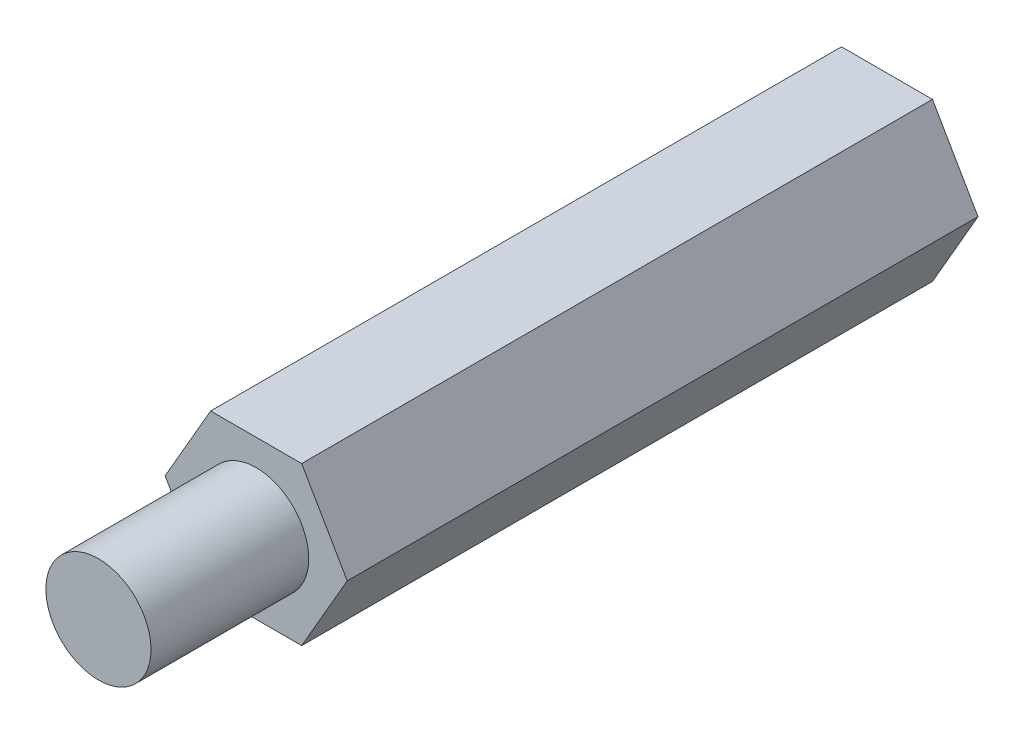
ISO-10303-21;
HEADER;
FILE_DESCRIPTION(('STEP AP214'),'2;1');
FILE_NAME('part.step','',(''),(''),'','','');
FILE_SCHEMA(('AUTOMOTIVE_DESIGN { 1 0 10303 214 1 1 1 1 }'));
ENDSEC;
DATA;
#1=APPLICATION_CONTEXT('core data for automotive mechanical design processes');
#2=APPLICATION_PROTOCOL_DEFINITION('international standard','automotive_design',2000,#1);
#3=PRODUCT_CONTEXT('',#1,'mechanical');
#4=PRODUCT('Part','Part','',(#3));
#5=PRODUCT_RELATED_PRODUCT_CATEGORY('part','',(#4));
#6=PRODUCT_DEFINITION_FORMATION('','',#4);
#7=PRODUCT_DEFINITION_CONTEXT('part definition',#1,'design');
#8=PRODUCT_DEFINITION('design','',#6,#7);
#9=PRODUCT_DEFINITION_SHAPE('','',#8);
#10=(LENGTH_UNIT() NAMED_UNIT(*) SI_UNIT(.MILLI.,.METRE.));
#11=(NAMED_UNIT(*) PLANE_ANGLE_UNIT() SI_UNIT($,.RADIAN.));
#12=(NAMED_UNIT(*) SI_UNIT($,.STERADIAN.) SOLID_ANGLE_UNIT());
#13=UNCERTAINTY_MEASURE_WITH_UNIT(LENGTH_MEASURE(1.E-05),#10,'distance_accuracy_value','');
#14=(GEOMETRIC_REPRESENTATION_CONTEXT(3) GLOBAL_UNCERTAINTY_ASSIGNED_CONTEXT((#13)) GLOBAL_UNIT_ASSIGNED_CONTEXT((#10,
#11,#12)) REPRESENTATION_CONTEXT('',''));
#15=CARTESIAN_POINT('',(0.,0.,0.));
#16=DIRECTION('',(0.,0.,1.));
#17=DIRECTION('',(1.,0.,0.));
#18=AXIS2_PLACEMENT_3D('',#15,#16,#17);
#19=CARTESIAN_POINT('',(0.,0.,0.));
#20=DIRECTION('',(0.,0.,1.));
#21=DIRECTION('',(1.,0.,0.));
#22=AXIS2_PLACEMENT_3D('',#19,#20,#21);
#23=PLANE('',#22);
#24=DIRECTION('',(1.,0.,0.));
#25=VECTOR('',#24,1.);
#26=CARTESIAN_POINT('',(-0.866025403784438,-1.5,0.));
#27=LINE('',#26,#25);
#28=CARTESIAN_POINT('',(-0.866025403784438,-1.5,0.));
#29=VERTEX_POINT('',#28);
#30=CARTESIAN_POINT('',(0.866025403784439,-1.5,0.));
#31=VERTEX_POINT('',#30);
#32=EDGE_CURVE('E122',#29,#31,#27,.T.);
#33=ORIENTED_EDGE('',*,*,#32,.F.);
#34=DIRECTION('',(0.5,-0.866025403784439,0.));
#35=VECTOR('',#34,1.);
#36=CARTESIAN_POINT('',(-1.73205080756888,0.,0.));
#37=LINE('',#36,#35);
#38=CARTESIAN_POINT('',(-1.73205080756888,0.,0.));
#39=VERTEX_POINT('',#38);
#40=EDGE_CURVE('E81',#39,#29,#37,.T.);
#41=ORIENTED_EDGE('',*,*,#40,.F.);
#42=DIRECTION('',(-0.5,-0.866025403784439,0.));
#43=VECTOR('',#42,1.);
#44=CARTESIAN_POINT('',(-0.866025403784439,1.5,0.));
#45=LINE('',#44,#43);
#46=CARTESIAN_POINT('',(-0.866025403784439,1.5,0.));
#47=VERTEX_POINT('',#46);
#48=EDGE_CURVE('E75',#47,#39,#45,.T.);
#49=ORIENTED_EDGE('',*,*,#48,.F.);
#50=DIRECTION('',(-1.,0.,0.));
#51=VECTOR('',#50,1.);
#52=CARTESIAN_POINT('',(0.866025403784439,1.5,0.));
#53=LINE('',#52,#51);
#54=CARTESIAN_POINT('',(0.866025403784439,1.5,0.));
#55=VERTEX_POINT('',#54);
#56=EDGE_CURVE('E112',#55,#47,#53,.T.);
#57=ORIENTED_EDGE('',*,*,#56,.F.);
#58=DIRECTION('',(-0.5,0.866025403784439,0.));
#59=VECTOR('',#58,1.);
#60=CARTESIAN_POINT('',(1.73205080756888,0.,0.));
#61=LINE('',#60,#59);
#62=CARTESIAN_POINT('',(1.73205080756888,0.,0.));
#63=VERTEX_POINT('',#62);
#64=EDGE_CURVE('E128',#63,#55,#61,.T.);
#65=ORIENTED_EDGE('',*,*,#64,.F.);
#66=DIRECTION('',(0.5,0.866025403784439,0.));
#67=VECTOR('',#66,1.);
#68=CARTESIAN_POINT('',(0.866025403784439,-1.5,0.));
#69=LINE('',#68,#67);
#70=EDGE_CURVE('E125',#31,#63,#69,.T.);
#71=ORIENTED_EDGE('',*,*,#70,.F.);
#72=EDGE_LOOP('',(#33,#41,#49,#57,#65,#71));
#73=FACE_BOUND('',#72,.T.);
#74=CARTESIAN_POINT('',(0.,0.,0.));
#75=DIRECTION('',(0.,0.,-1.));
#76=DIRECTION('',(-1.,0.,0.));
#77=AXIS2_PLACEMENT_3D('',#74,#75,#76);
#78=CIRCLE('',#77,1.19999999999999);
#79=CARTESIAN_POINT('',(-1.19999999999999,0.,0.));
#80=VERTEX_POINT('',#79);
#81=EDGE_CURVE('E156',#80,#80,#78,.T.);
#82=ORIENTED_EDGE('',*,*,#81,.F.);
#83=EDGE_LOOP('',(#82));
#84=FACE_BOUND('',#83,.T.);
#85=ADVANCED_FACE('F33',(#73,#84),#23,.F.);
#86=CARTESIAN_POINT('',(-0.866025403784438,-1.5,12.));
#87=DIRECTION('',(0.,1.,0.));
#88=DIRECTION('',(-1.,0.,0.));
#89=AXIS2_PLACEMENT_3D('',#86,#87,#88);
#90=PLANE('',#89);
#91=ORIENTED_EDGE('',*,*,#32,.T.);
#92=DIRECTION('',(0.,0.,-1.));
#93=VECTOR('',#92,1.);
#94=CARTESIAN_POINT('',(0.866025403784439,-1.5,12.));
#95=LINE('',#94,#93);
#96=CARTESIAN_POINT('',(0.866025403784439,-1.5,12.));
#97=VERTEX_POINT('',#96);
#98=EDGE_CURVE('E37',#97,#31,#95,.T.);
#99=ORIENTED_EDGE('',*,*,#98,.F.);
#100=DIRECTION('',(1.,0.,0.));
#101=VECTOR('',#100,1.);
#102=CARTESIAN_POINT('',(-0.866025403784438,-1.5,12.));
#103=LINE('',#102,#101);
#104=CARTESIAN_POINT('',(-0.866025403784438,-1.5,12.));
#105=VERTEX_POINT('',#104);
#106=EDGE_CURVE('E133',#105,#97,#103,.T.);
#107=ORIENTED_EDGE('',*,*,#106,.F.);
#108=DIRECTION('',(0.,0.,-1.));
#109=VECTOR('',#108,1.);
#110=CARTESIAN_POINT('',(-0.866025403784438,-1.5,12.));
#111=LINE('',#110,#109);
#112=EDGE_CURVE('E118',#105,#29,#111,.T.);
#113=ORIENTED_EDGE('',*,*,#112,.T.);
#114=EDGE_LOOP('',(#91,#99,#107,#113));
#115=FACE_BOUND('',#114,.T.);
#116=ADVANCED_FACE('F35',(#115),#90,.F.);
#117=CARTESIAN_POINT('',(0.866025403784439,-1.5,12.));
#118=DIRECTION('',(-0.866025403784439,0.5,0.));
#119=DIRECTION('',(-0.5,-0.866025403784439,0.));
#120=AXIS2_PLACEMENT_3D('',#117,#118,#119);
#121=PLANE('',#120);
#122=ORIENTED_EDGE('',*,*,#70,.T.);
#123=DIRECTION('',(0.,0.,-1.));
#124=VECTOR('',#123,1.);
#125=CARTESIAN_POINT('',(1.73205080756888,0.,12.));
#126=LINE('',#125,#124);
#127=CARTESIAN_POINT('',(1.73205080756888,0.,12.));
#128=VERTEX_POINT('',#127);
#129=EDGE_CURVE('E136',#128,#63,#126,.T.);
#130=ORIENTED_EDGE('',*,*,#129,.F.);
#131=DIRECTION('',(0.5,0.866025403784439,0.));
#132=VECTOR('',#131,1.);
#133=CARTESIAN_POINT('',(0.866025403784439,-1.5,12.));
#134=LINE('',#133,#132);
#135=EDGE_CURVE('E90',#97,#128,#134,.T.);
#136=ORIENTED_EDGE('',*,*,#135,.F.);
#137=ORIENTED_EDGE('',*,*,#98,.T.);
#138=EDGE_LOOP('',(#122,#130,#136,#137));
#139=FACE_BOUND('',#138,.T.);
#140=ADVANCED_FACE('F141',(#139),#121,.F.);
#141=CARTESIAN_POINT('',(1.73205080756888,0.,12.));
#142=DIRECTION('',(-0.866025403784438,-0.5,0.));
#143=DIRECTION('',(0.5,-0.866025403784439,0.));
#144=AXIS2_PLACEMENT_3D('',#141,#142,#143);
#145=PLANE('',#144);
#146=ORIENTED_EDGE('',*,*,#64,.T.);
#147=DIRECTION('',(0.,0.,-1.));
#148=VECTOR('',#147,1.);
#149=CARTESIAN_POINT('',(0.866025403784439,1.5,12.));
#150=LINE('',#149,#148);
#151=CARTESIAN_POINT('',(0.866025403784439,1.5,12.));
#152=VERTEX_POINT('',#151);
#153=EDGE_CURVE('E113',#152,#55,#150,.T.);
#154=ORIENTED_EDGE('',*,*,#153,.F.);
#155=DIRECTION('',(-0.5,0.866025403784439,0.));
#156=VECTOR('',#155,1.);
#157=CARTESIAN_POINT('',(1.73205080756888,0.,12.));
#158=LINE('',#157,#156);
#159=EDGE_CURVE('E104',#128,#152,#158,.T.);
#160=ORIENTED_EDGE('',*,*,#159,.F.);
#161=ORIENTED_EDGE('',*,*,#129,.T.);
#162=EDGE_LOOP('',(#146,#154,#160,#161));
#163=FACE_BOUND('',#162,.T.);
#164=ADVANCED_FACE('F147',(#163),#145,.F.);
#165=CARTESIAN_POINT('',(0.866025403784439,1.5,12.));
#166=DIRECTION('',(0.,-1.,0.));
#167=DIRECTION('',(0.,0.,-1.));
#168=AXIS2_PLACEMENT_3D('',#165,#166,#167);
#169=PLANE('',#168);
#170=ORIENTED_EDGE('',*,*,#56,.T.);
#171=DIRECTION('',(0.,0.,-1.));
#172=VECTOR('',#171,1.);
#173=CARTESIAN_POINT('',(-0.866025403784439,1.5,12.));
#174=LINE('',#173,#172);
#175=CARTESIAN_POINT('',(-0.866025403784439,1.5,12.));
#176=VERTEX_POINT('',#175);
#177=EDGE_CURVE('E109',#176,#47,#174,.T.);
#178=ORIENTED_EDGE('',*,*,#177,.F.);
#179=DIRECTION('',(-1.,0.,0.));
#180=VECTOR('',#179,1.);
#181=CARTESIAN_POINT('',(0.866025403784439,1.5,12.));
#182=LINE('',#181,#180);
#183=EDGE_CURVE('E98',#152,#176,#182,.T.);
#184=ORIENTED_EDGE('',*,*,#183,.F.);
#185=ORIENTED_EDGE('',*,*,#153,.T.);
#186=EDGE_LOOP('',(#170,#178,#184,#185));
#187=FACE_BOUND('',#186,.T.);
#188=ADVANCED_FACE('F110',(#187),#169,.F.);
#189=CARTESIAN_POINT('',(-0.866025403784439,1.5,12.));
#190=DIRECTION('',(0.866025403784439,-0.5,0.));
#191=DIRECTION('',(0.5,0.866025403784439,0.));
#192=AXIS2_PLACEMENT_3D('',#189,#190,#191);
#193=PLANE('',#192);
#194=ORIENTED_EDGE('',*,*,#48,.T.);
#195=DIRECTION('',(0.,0.,-1.));
#196=VECTOR('',#195,1.);
#197=CARTESIAN_POINT('',(-1.73205080756888,0.,12.));
#198=LINE('',#197,#196);
#199=CARTESIAN_POINT('',(-1.73205080756888,0.,12.));
#200=VERTEX_POINT('',#199);
#201=EDGE_CURVE('E114',#200,#39,#198,.T.);
#202=ORIENTED_EDGE('',*,*,#201,.F.);
#203=DIRECTION('',(-0.5,-0.866025403784439,0.));
#204=VECTOR('',#203,1.);
#205=CARTESIAN_POINT('',(-0.866025403784439,1.5,12.));
#206=LINE('',#205,#204);
#207=EDGE_CURVE('E102',#176,#200,#206,.T.);
#208=ORIENTED_EDGE('',*,*,#207,.F.);
#209=ORIENTED_EDGE('',*,*,#177,.T.);
#210=EDGE_LOOP('',(#194,#202,#208,#209));
#211=FACE_BOUND('',#210,.T.);
#212=ADVANCED_FACE('F116',(#211),#193,.F.);
#213=CARTESIAN_POINT('',(-1.73205080756888,0.,12.));
#214=DIRECTION('',(0.866025403784439,0.5,0.));
#215=DIRECTION('',(-0.5,0.866025403784439,0.));
#216=AXIS2_PLACEMENT_3D('',#213,#214,#215);
#217=PLANE('',#216);
#218=ORIENTED_EDGE('',*,*,#40,.T.);
#219=ORIENTED_EDGE('',*,*,#112,.F.);
#220=DIRECTION('',(0.5,-0.866025403784439,0.));
#221=VECTOR('',#220,1.);
#222=CARTESIAN_POINT('',(-1.73205080756888,0.,12.));
#223=LINE('',#222,#221);
#224=EDGE_CURVE('E51',#200,#105,#223,.T.);
#225=ORIENTED_EDGE('',*,*,#224,.F.);
#226=ORIENTED_EDGE('',*,*,#201,.T.);
#227=EDGE_LOOP('',(#218,#219,#225,#226));
#228=FACE_BOUND('',#227,.T.);
#229=ADVANCED_FACE('F169',(#228),#217,.F.);
#230=CARTESIAN_POINT('',(0.,0.,12.));
#231=DIRECTION('',(0.,0.,1.));
#232=DIRECTION('',(1.,0.,0.));
#233=AXIS2_PLACEMENT_3D('',#230,#231,#232);
#234=PLANE('',#233);
#235=CARTESIAN_POINT('',(0.,0.,12.));
#236=DIRECTION('',(0.,0.,1.));
#237=DIRECTION('',(1.,0.,0.));
#238=AXIS2_PLACEMENT_3D('',#235,#236,#237);
#239=CIRCLE('',#238,1.);
#240=CARTESIAN_POINT('',(1.,0.,12.));
#241=VERTEX_POINT('',#240);
#242=EDGE_CURVE('E11',#241,#241,#239,.T.);
#243=ORIENTED_EDGE('',*,*,#242,.F.);
#244=EDGE_LOOP('',(#243));
#245=FACE_BOUND('',#244,.T.);
#246=ORIENTED_EDGE('',*,*,#106,.T.);
#247=ORIENTED_EDGE('',*,*,#135,.T.);
#248=ORIENTED_EDGE('',*,*,#159,.T.);
#249=ORIENTED_EDGE('',*,*,#183,.T.);
#250=ORIENTED_EDGE('',*,*,#207,.T.);
#251=ORIENTED_EDGE('',*,*,#224,.T.);
#252=EDGE_LOOP('',(#246,#247,#248,#249,#250,#251));
#253=FACE_BOUND('',#252,.T.);
#254=ADVANCED_FACE('F100',(#245,#253),#234,.T.);
#255=CARTESIAN_POINT('',(0.,0.,15.));
#256=DIRECTION('',(0.,0.,-1.));
#257=DIRECTION('',(-1.,0.,0.));
#258=AXIS2_PLACEMENT_3D('',#255,#256,#257);
#259=CYLINDRICAL_SURFACE('',#258,1.);
#260=CARTESIAN_POINT('',(0.,0.,15.));
#261=DIRECTION('',(0.,0.,1.));
#262=DIRECTION('',(1.,0.,0.));
#263=AXIS2_PLACEMENT_3D('',#260,#261,#262);
#264=CIRCLE('',#263,1.);
#265=CARTESIAN_POINT('',(1.,0.,15.));
#266=VERTEX_POINT('',#265);
#267=EDGE_CURVE('E126',#266,#266,#264,.T.);
#268=ORIENTED_EDGE('',*,*,#267,.F.);
#269=EDGE_LOOP('',(#268));
#270=FACE_BOUND('',#269,.T.);
#271=ORIENTED_EDGE('',*,*,#242,.T.);
#272=EDGE_LOOP('',(#271));
#273=FACE_BOUND('',#272,.T.);
#274=ADVANCED_FACE('F204',(#270,#273),#259,.T.);
#275=CARTESIAN_POINT('',(0.,0.,15.));
#276=DIRECTION('',(0.,0.,1.));
#277=DIRECTION('',(1.,0.,0.));
#278=AXIS2_PLACEMENT_3D('',#275,#276,#277);
#279=PLANE('',#278);
#280=ORIENTED_EDGE('',*,*,#267,.T.);
#281=EDGE_LOOP('',(#280));
#282=FACE_BOUND('',#281,.T.);
#283=ADVANCED_FACE('F211',(#282),#279,.T.);
#284=CARTESIAN_POINT('',(0.,0.,3.));
#285=DIRECTION('',(0.,0.,-1.));
#286=DIRECTION('',(-1.,0.,0.));
#287=AXIS2_PLACEMENT_3D('',#284,#285,#286);
#288=CONICAL_SURFACE('',#287,1.2,1.02974425867665);
#289=CARTESIAN_POINT('',(0.,0.,3.72103274283307));
#290=VERTEX_POINT('',#289);
#291=VERTEX_LOOP('',#290);
#292=FACE_BOUND('',#291,.T.);
#293=CARTESIAN_POINT('',(0.,0.,3.));
#294=DIRECTION('',(0.,0.,-1.));
#295=DIRECTION('',(-1.,0.,0.));
#296=AXIS2_PLACEMENT_3D('',#293,#294,#295);
#297=CIRCLE('',#296,1.2);
#298=CARTESIAN_POINT('',(-1.2,0.,3.));
#299=VERTEX_POINT('',#298);
#300=EDGE_CURVE('E153',#299,#299,#297,.T.);
#301=ORIENTED_EDGE('',*,*,#300,.T.);
#302=EDGE_LOOP('',(#301));
#303=FACE_BOUND('',#302,.T.);
#304=ADVANCED_FACE('F218',(#292,#303),#288,.F.);
#305=CARTESIAN_POINT('',(0.,0.,0.));
#306=DIRECTION('',(0.,0.,-1.));
#307=DIRECTION('',(-1.,0.,0.));
#308=AXIS2_PLACEMENT_3D('',#305,#306,#307);
#309=CYLINDRICAL_SURFACE('',#308,1.19999999999999);
#310=ORIENTED_EDGE('',*,*,#300,.F.);
#311=EDGE_LOOP('',(#310));
#312=FACE_BOUND('',#311,.T.);
#313=ORIENTED_EDGE('',*,*,#81,.T.);
#314=EDGE_LOOP('',(#313));
#315=FACE_BOUND('',#314,.T.);
#316=ADVANCED_FACE('F160',(#312,#315),#309,.F.);
#317=CLOSED_SHELL('',(#85,#116,#140,#164,#188,#212,#229,#254,#274,#283,#304,#316));
#318=MANIFOLD_SOLID_BREP('B2',#317);
#319=ADVANCED_BREP_SHAPE_REPRESENTATION('',(#18,#318),#14);
#320=SHAPE_DEFINITION_REPRESENTATION(#9,#319);
ENDSEC;
END-ISO-10303-21;
